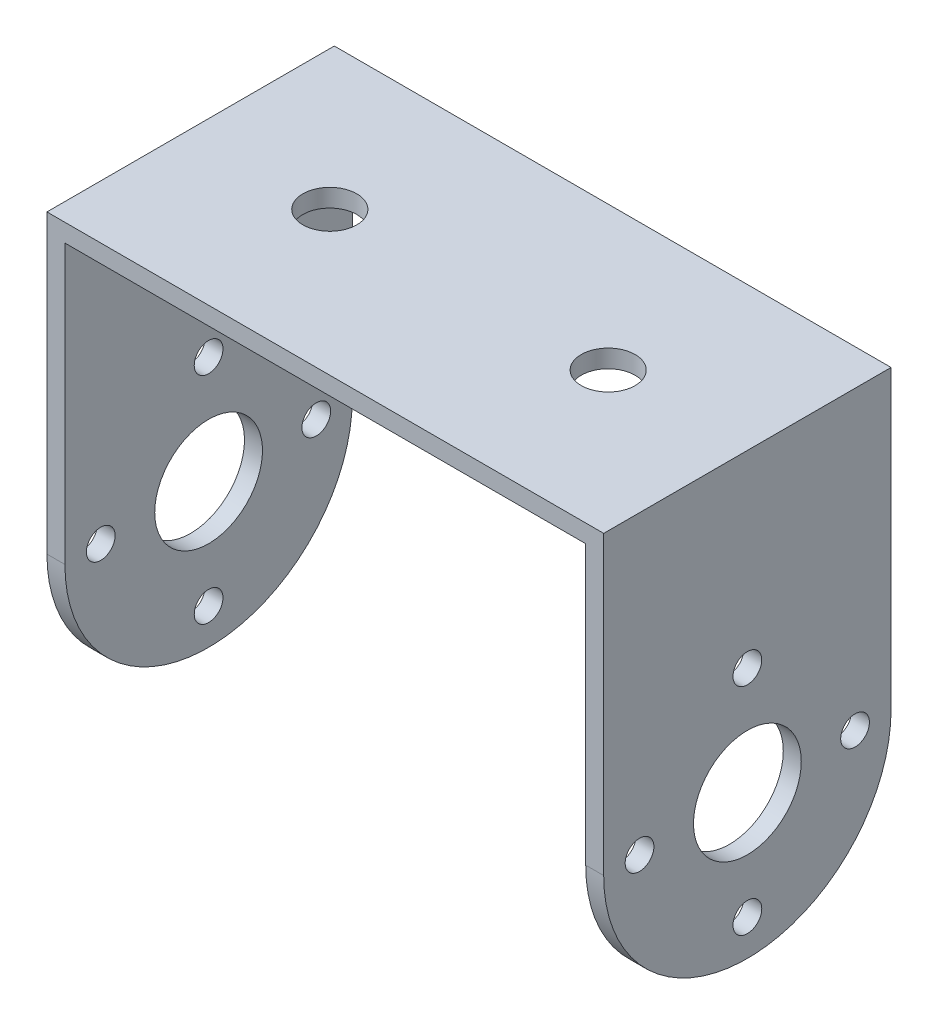
ISO-10303-21;
HEADER;
FILE_DESCRIPTION(('STEP AP214'),'2;1');
FILE_NAME('part.step','',(''),(''),'','','');
FILE_SCHEMA(('AUTOMOTIVE_DESIGN { 1 0 10303 214 1 1 1 1 }'));
ENDSEC;
DATA;
#1=APPLICATION_CONTEXT('core data for automotive mechanical design processes');
#2=APPLICATION_PROTOCOL_DEFINITION('international standard','automotive_design',2000,#1);
#3=PRODUCT_CONTEXT('',#1,'mechanical');
#4=PRODUCT('Part','Part','',(#3));
#5=PRODUCT_RELATED_PRODUCT_CATEGORY('part','',(#4));
#6=PRODUCT_DEFINITION_FORMATION('','',#4);
#7=PRODUCT_DEFINITION_CONTEXT('part definition',#1,'design');
#8=PRODUCT_DEFINITION('design','',#6,#7);
#9=PRODUCT_DEFINITION_SHAPE('','',#8);
#10=(LENGTH_UNIT() NAMED_UNIT(*) SI_UNIT(.MILLI.,.METRE.));
#11=(NAMED_UNIT(*) PLANE_ANGLE_UNIT() SI_UNIT($,.RADIAN.));
#12=(NAMED_UNIT(*) SI_UNIT($,.STERADIAN.) SOLID_ANGLE_UNIT());
#13=UNCERTAINTY_MEASURE_WITH_UNIT(LENGTH_MEASURE(1.E-05),#10,'distance_accuracy_value','');
#14=(GEOMETRIC_REPRESENTATION_CONTEXT(3) GLOBAL_UNCERTAINTY_ASSIGNED_CONTEXT((#13)) GLOBAL_UNIT_ASSIGNED_CONTEXT((#10,
#11,#12)) REPRESENTATION_CONTEXT('',''));
#15=CARTESIAN_POINT('',(0.,0.,0.));
#16=DIRECTION('',(0.,0.,1.));
#17=DIRECTION('',(1.,0.,0.));
#18=AXIS2_PLACEMENT_3D('',#15,#16,#17);
#19=CARTESIAN_POINT('',(31.,38.775594,-35.5206464472841));
#20=DIRECTION('',(-1.,0.,0.));
#21=DIRECTION('',(0.,0.,1.));
#22=AXIS2_PLACEMENT_3D('',#19,#20,#21);
#23=CYLINDRICAL_SURFACE('',#22,8.);
#24=DIRECTION('',(-1.,0.,0.));
#25=VECTOR('',#24,1.);
#26=CARTESIAN_POINT('',(31.,38.775594,-27.5206464472841));
#27=LINE('',#26,#25);
#28=CARTESIAN_POINT('',(31.,38.775594,-27.5206464472841));
#29=VERTEX_POINT('',#28);
#30=CARTESIAN_POINT('',(29.9988322937708,38.775594,-27.5206464472841));
#31=VERTEX_POINT('',#30);
#32=EDGE_CURVE('E146',#29,#31,#27,.T.);
#33=ORIENTED_EDGE('',*,*,#32,.T.);
#34=CARTESIAN_POINT('',(29.9988322937708,38.775594,-35.5206464472841));
#35=DIRECTION('',(1.,0.,0.));
#36=DIRECTION('',(0.,0.,-1.));
#37=AXIS2_PLACEMENT_3D('',#34,#35,#36);
#38=CIRCLE('',#37,8.);
#39=CARTESIAN_POINT('',(29.9988322937708,38.775594,-43.5206464472842));
#40=VERTEX_POINT('',#39);
#41=EDGE_CURVE('E184',#31,#40,#38,.T.);
#42=ORIENTED_EDGE('',*,*,#41,.T.);
#43=DIRECTION('',(-1.,0.,0.));
#44=VECTOR('',#43,1.);
#45=CARTESIAN_POINT('',(31.,38.775594,-43.5206464472842));
#46=LINE('',#45,#44);
#47=CARTESIAN_POINT('',(31.,38.775594,-43.5206464472842));
#48=VERTEX_POINT('',#47);
#49=EDGE_CURVE('E48',#48,#40,#46,.T.);
#50=ORIENTED_EDGE('',*,*,#49,.F.);
#51=CARTESIAN_POINT('',(31.,38.775594,-35.5206464472841));
#52=DIRECTION('',(1.,0.,0.));
#53=DIRECTION('',(0.,0.,-1.));
#54=AXIS2_PLACEMENT_3D('',#51,#52,#53);
#55=CIRCLE('',#54,8.);
#56=EDGE_CURVE('E118',#29,#48,#55,.T.);
#57=ORIENTED_EDGE('',*,*,#56,.F.);
#58=EDGE_LOOP('',(#33,#42,#50,#57));
#59=FACE_BOUND('',#58,.T.);
#60=ADVANCED_FACE('F40',(#59),#23,.T.);
#61=CARTESIAN_POINT('',(31.,44.775594,-35.5206464472841));
#62=DIRECTION('',(-1.,0.,0.));
#63=DIRECTION('',(0.,0.,1.));
#64=AXIS2_PLACEMENT_3D('',#61,#62,#63);
#65=CYLINDRICAL_SURFACE('',#64,0.799999999999996);
#66=CARTESIAN_POINT('',(1.00116770622924,44.775594,-35.5206464472841));
#67=DIRECTION('',(-1.,0.,0.));
#68=DIRECTION('',(0.,0.,1.));
#69=AXIS2_PLACEMENT_3D('',#66,#67,#68);
#70=CIRCLE('',#69,0.799999999999996);
#71=CARTESIAN_POINT('',(1.00116770622924,44.775594,-34.7206464472841));
#72=VERTEX_POINT('',#71);
#73=EDGE_CURVE('E212',#72,#72,#70,.T.);
#74=ORIENTED_EDGE('',*,*,#73,.F.);
#75=EDGE_LOOP('',(#74));
#76=FACE_BOUND('',#75,.T.);
#77=CARTESIAN_POINT('',(0.,44.775594,-35.5206464472841));
#78=DIRECTION('',(1.,0.,0.));
#79=DIRECTION('',(0.,0.,-1.));
#80=AXIS2_PLACEMENT_3D('',#77,#78,#79);
#81=CIRCLE('',#80,0.799999999999996);
#82=CARTESIAN_POINT('',(0.,44.775594,-36.3206464472841));
#83=VERTEX_POINT('',#82);
#84=EDGE_CURVE('E241',#83,#83,#81,.T.);
#85=ORIENTED_EDGE('',*,*,#84,.F.);
#86=EDGE_LOOP('',(#85));
#87=FACE_BOUND('',#86,.T.);
#88=ADVANCED_FACE('F174',(#76,#87),#65,.F.);
#89=CARTESIAN_POINT('',(31.,38.775594,-35.5206464472841));
#90=DIRECTION('',(-1.,0.,0.));
#91=DIRECTION('',(0.,0.,1.));
#92=AXIS2_PLACEMENT_3D('',#89,#90,#91);
#93=CYLINDRICAL_SURFACE('',#92,3.);
#94=CARTESIAN_POINT('',(1.00116770622924,38.775594,-35.5206464472841));
#95=DIRECTION('',(-1.,0.,0.));
#96=DIRECTION('',(0.,0.,1.));
#97=AXIS2_PLACEMENT_3D('',#94,#95,#96);
#98=CIRCLE('',#97,3.);
#99=CARTESIAN_POINT('',(1.00116770622924,38.775594,-32.5206464472841));
#100=VERTEX_POINT('',#99);
#101=EDGE_CURVE('E209',#100,#100,#98,.T.);
#102=ORIENTED_EDGE('',*,*,#101,.F.);
#103=EDGE_LOOP('',(#102));
#104=FACE_BOUND('',#103,.T.);
#105=CARTESIAN_POINT('',(0.,38.775594,-35.5206464472841));
#106=DIRECTION('',(1.,0.,0.));
#107=DIRECTION('',(0.,0.,-1.));
#108=AXIS2_PLACEMENT_3D('',#105,#106,#107);
#109=CIRCLE('',#108,3.);
#110=CARTESIAN_POINT('',(0.,38.775594,-38.5206464472841));
#111=VERTEX_POINT('',#110);
#112=EDGE_CURVE('E235',#111,#111,#109,.T.);
#113=ORIENTED_EDGE('',*,*,#112,.F.);
#114=EDGE_LOOP('',(#113));
#115=FACE_BOUND('',#114,.T.);
#116=ADVANCED_FACE('F179',(#104,#115),#93,.F.);
#117=CARTESIAN_POINT('',(31.,38.775594,-41.5158813921745));
#118=DIRECTION('',(-1.,0.,0.));
#119=DIRECTION('',(0.,0.,1.));
#120=AXIS2_PLACEMENT_3D('',#117,#118,#119);
#121=CYLINDRICAL_SURFACE('',#120,0.800000000000003);
#122=CARTESIAN_POINT('',(1.00116770622924,38.775594,-41.5158813921745));
#123=DIRECTION('',(-1.,0.,0.));
#124=DIRECTION('',(0.,0.,1.));
#125=AXIS2_PLACEMENT_3D('',#122,#123,#124);
#126=CIRCLE('',#125,0.800000000000003);
#127=CARTESIAN_POINT('',(1.00116770622924,38.775594,-40.7158813921745));
#128=VERTEX_POINT('',#127);
#129=EDGE_CURVE('E206',#128,#128,#126,.T.);
#130=ORIENTED_EDGE('',*,*,#129,.F.);
#131=EDGE_LOOP('',(#130));
#132=FACE_BOUND('',#131,.T.);
#133=CARTESIAN_POINT('',(0.,38.775594,-41.5158813921745));
#134=DIRECTION('',(1.,0.,0.));
#135=DIRECTION('',(0.,0.,-1.));
#136=AXIS2_PLACEMENT_3D('',#133,#134,#135);
#137=CIRCLE('',#136,0.800000000000003);
#138=CARTESIAN_POINT('',(0.,38.775594,-42.3158813921745));
#139=VERTEX_POINT('',#138);
#140=EDGE_CURVE('E229',#139,#139,#137,.T.);
#141=ORIENTED_EDGE('',*,*,#140,.F.);
#142=EDGE_LOOP('',(#141));
#143=FACE_BOUND('',#142,.T.);
#144=ADVANCED_FACE('F267',(#132,#143),#121,.F.);
#145=CARTESIAN_POINT('',(31.,32.775594,-35.5206464472841));
#146=DIRECTION('',(-1.,0.,0.));
#147=DIRECTION('',(0.,0.,1.));
#148=AXIS2_PLACEMENT_3D('',#145,#146,#147);
#149=CYLINDRICAL_SURFACE('',#148,0.799999999999996);
#150=CARTESIAN_POINT('',(1.00116770622924,32.775594,-35.5206464472841));
#151=DIRECTION('',(-1.,0.,0.));
#152=DIRECTION('',(0.,0.,1.));
#153=AXIS2_PLACEMENT_3D('',#150,#151,#152);
#154=CIRCLE('',#153,0.799999999999996);
#155=CARTESIAN_POINT('',(1.00116770622924,32.775594,-34.7206464472841));
#156=VERTEX_POINT('',#155);
#157=EDGE_CURVE('E203',#156,#156,#154,.T.);
#158=ORIENTED_EDGE('',*,*,#157,.F.);
#159=EDGE_LOOP('',(#158));
#160=FACE_BOUND('',#159,.T.);
#161=CARTESIAN_POINT('',(0.,32.775594,-35.5206464472841));
#162=DIRECTION('',(1.,0.,0.));
#163=DIRECTION('',(0.,0.,-1.));
#164=AXIS2_PLACEMENT_3D('',#161,#162,#163);
#165=CIRCLE('',#164,0.799999999999996);
#166=CARTESIAN_POINT('',(0.,32.775594,-36.3206464472841));
#167=VERTEX_POINT('',#166);
#168=EDGE_CURVE('E223',#167,#167,#165,.T.);
#169=ORIENTED_EDGE('',*,*,#168,.F.);
#170=EDGE_LOOP('',(#169));
#171=FACE_BOUND('',#170,.T.);
#172=ADVANCED_FACE('F259',(#160,#171),#149,.F.);
#173=CARTESIAN_POINT('',(31.,38.775594,-29.5158813921745));
#174=DIRECTION('',(-1.,0.,0.));
#175=DIRECTION('',(0.,0.,1.));
#176=AXIS2_PLACEMENT_3D('',#173,#174,#175);
#177=CYLINDRICAL_SURFACE('',#176,0.799999999999996);
#178=CARTESIAN_POINT('',(1.00116770622924,38.775594,-29.5158813921745));
#179=DIRECTION('',(-1.,0.,0.));
#180=DIRECTION('',(0.,0.,1.));
#181=AXIS2_PLACEMENT_3D('',#178,#179,#180);
#182=CIRCLE('',#181,0.799999999999996);
#183=CARTESIAN_POINT('',(1.00116770622924,38.775594,-28.7158813921745));
#184=VERTEX_POINT('',#183);
#185=EDGE_CURVE('E200',#184,#184,#182,.T.);
#186=ORIENTED_EDGE('',*,*,#185,.F.);
#187=EDGE_LOOP('',(#186));
#188=FACE_BOUND('',#187,.T.);
#189=CARTESIAN_POINT('',(0.,38.775594,-29.5158813921745));
#190=DIRECTION('',(1.,0.,0.));
#191=DIRECTION('',(0.,0.,-1.));
#192=AXIS2_PLACEMENT_3D('',#189,#190,#191);
#193=CIRCLE('',#192,0.799999999999996);
#194=CARTESIAN_POINT('',(0.,38.775594,-30.3158813921745));
#195=VERTEX_POINT('',#194);
#196=EDGE_CURVE('E219',#195,#195,#193,.T.);
#197=ORIENTED_EDGE('',*,*,#196,.F.);
#198=EDGE_LOOP('',(#197));
#199=FACE_BOUND('',#198,.T.);
#200=ADVANCED_FACE('F258',(#188,#199),#177,.F.);
#201=CARTESIAN_POINT('',(31.,55.275594,-43.5206464472842));
#202=DIRECTION('',(0.,0.,1.));
#203=DIRECTION('',(1.,0.,0.));
#204=AXIS2_PLACEMENT_3D('',#201,#202,#203);
#205=PLANE('',#204);
#206=ORIENTED_EDGE('',*,*,#49,.T.);
#207=DIRECTION('',(0.,1.,0.));
#208=VECTOR('',#207,1.);
#209=CARTESIAN_POINT('',(29.9988322937708,55.275594,-43.5206464472842));
#210=LINE('',#209,#208);
#211=CARTESIAN_POINT('',(29.9988322937708,54.275594,-43.5206464472842));
#212=VERTEX_POINT('',#211);
#213=EDGE_CURVE('E192',#40,#212,#210,.T.);
#214=ORIENTED_EDGE('',*,*,#213,.T.);
#215=DIRECTION('',(-1.,0.,0.));
#216=VECTOR('',#215,1.);
#217=CARTESIAN_POINT('',(0.,54.275594,-43.5206464472842));
#218=LINE('',#217,#216);
#219=CARTESIAN_POINT('',(1.00116770622924,54.275594,-43.5206464472842));
#220=VERTEX_POINT('',#219);
#221=EDGE_CURVE('E129',#212,#220,#218,.T.);
#222=ORIENTED_EDGE('',*,*,#221,.T.);
#223=DIRECTION('',(0.,-1.,0.));
#224=VECTOR('',#223,1.);
#225=CARTESIAN_POINT('',(1.00116770622924,55.275594,-43.5206464472842));
#226=LINE('',#225,#224);
#227=CARTESIAN_POINT('',(1.00116770622924,38.775594,-43.5206464472842));
#228=VERTEX_POINT('',#227);
#229=EDGE_CURVE('E154',#220,#228,#226,.T.);
#230=ORIENTED_EDGE('',*,*,#229,.T.);
#231=CARTESIAN_POINT('',(0.,38.775594,-43.5206464472842));
#232=VERTEX_POINT('',#231);
#233=EDGE_CURVE('E149',#228,#232,#46,.T.);
#234=ORIENTED_EDGE('',*,*,#233,.T.);
#235=DIRECTION('',(0.,1.,0.));
#236=VECTOR('',#235,1.);
#237=CARTESIAN_POINT('',(0.,55.275594,-43.5206464472842));
#238=LINE('',#237,#236);
#239=CARTESIAN_POINT('',(0.,55.275594,-43.5206464472842));
#240=VERTEX_POINT('',#239);
#241=EDGE_CURVE('E125',#232,#240,#238,.T.);
#242=ORIENTED_EDGE('',*,*,#241,.T.);
#243=DIRECTION('',(-1.,0.,0.));
#244=VECTOR('',#243,1.);
#245=CARTESIAN_POINT('',(0.,55.275594,-43.5206464472842));
#246=LINE('',#245,#244);
#247=CARTESIAN_POINT('',(31.,55.275594,-43.5206464472842));
#248=VERTEX_POINT('',#247);
#249=EDGE_CURVE('E122',#248,#240,#246,.T.);
#250=ORIENTED_EDGE('',*,*,#249,.F.);
#251=DIRECTION('',(0.,1.,0.));
#252=VECTOR('',#251,1.);
#253=CARTESIAN_POINT('',(31.,55.275594,-43.5206464472842));
#254=LINE('',#253,#252);
#255=EDGE_CURVE('E89',#48,#248,#254,.T.);
#256=ORIENTED_EDGE('',*,*,#255,.F.);
#257=EDGE_LOOP('',(#206,#214,#222,#230,#234,#242,#250,#256));
#258=FACE_BOUND('',#257,.T.);
#259=ADVANCED_FACE('F123',(#258),#205,.F.);
#260=CARTESIAN_POINT('',(31.,38.775594,-35.5206464472841));
#261=DIRECTION('',(1.,0.,0.));
#262=DIRECTION('',(0.,0.,-1.));
#263=AXIS2_PLACEMENT_3D('',#260,#261,#262);
#264=PLANE('',#263);
#265=ORIENTED_EDGE('',*,*,#255,.T.);
#266=DIRECTION('',(0.,0.,1.));
#267=VECTOR('',#266,1.);
#268=CARTESIAN_POINT('',(31.,55.275594,-27.5206464472841));
#269=LINE('',#268,#267);
#270=CARTESIAN_POINT('',(31.,55.275594,-27.5206464472841));
#271=VERTEX_POINT('',#270);
#272=EDGE_CURVE('E115',#248,#271,#269,.T.);
#273=ORIENTED_EDGE('',*,*,#272,.T.);
#274=DIRECTION('',(0.,-1.,0.));
#275=VECTOR('',#274,1.);
#276=CARTESIAN_POINT('',(31.,38.775594,-27.5206464472841));
#277=LINE('',#276,#275);
#278=EDGE_CURVE('E64',#271,#29,#277,.T.);
#279=ORIENTED_EDGE('',*,*,#278,.T.);
#280=ORIENTED_EDGE('',*,*,#56,.T.);
#281=EDGE_LOOP('',(#265,#273,#279,#280));
#282=FACE_BOUND('',#281,.T.);
#283=CARTESIAN_POINT('',(31.,32.775594,-35.5206464472841));
#284=DIRECTION('',(1.,0.,0.));
#285=DIRECTION('',(0.,0.,-1.));
#286=AXIS2_PLACEMENT_3D('',#283,#284,#285);
#287=CIRCLE('',#286,0.799999999999996);
#288=CARTESIAN_POINT('',(31.,32.775594,-36.3206464472841));
#289=VERTEX_POINT('',#288);
#290=EDGE_CURVE('E226',#289,#289,#287,.T.);
#291=ORIENTED_EDGE('',*,*,#290,.F.);
#292=EDGE_LOOP('',(#291));
#293=FACE_BOUND('',#292,.T.);
#294=CARTESIAN_POINT('',(31.,38.775594,-35.5206464472841));
#295=DIRECTION('',(1.,0.,0.));
#296=DIRECTION('',(0.,0.,-1.));
#297=AXIS2_PLACEMENT_3D('',#294,#295,#296);
#298=CIRCLE('',#297,3.);
#299=CARTESIAN_POINT('',(31.,38.775594,-38.5206464472841));
#300=VERTEX_POINT('',#299);
#301=EDGE_CURVE('E238',#300,#300,#298,.T.);
#302=ORIENTED_EDGE('',*,*,#301,.F.);
#303=EDGE_LOOP('',(#302));
#304=FACE_BOUND('',#303,.T.);
#305=CARTESIAN_POINT('',(31.,44.775594,-35.5206464472841));
#306=DIRECTION('',(1.,0.,0.));
#307=DIRECTION('',(0.,0.,-1.));
#308=AXIS2_PLACEMENT_3D('',#305,#306,#307);
#309=CIRCLE('',#308,0.799999999999996);
#310=CARTESIAN_POINT('',(31.,44.775594,-36.3206464472841));
#311=VERTEX_POINT('',#310);
#312=EDGE_CURVE('E140',#311,#311,#309,.T.);
#313=ORIENTED_EDGE('',*,*,#312,.F.);
#314=EDGE_LOOP('',(#313));
#315=FACE_BOUND('',#314,.T.);
#316=CARTESIAN_POINT('',(31.,38.775594,-41.5158813921745));
#317=DIRECTION('',(1.,0.,0.));
#318=DIRECTION('',(0.,0.,-1.));
#319=AXIS2_PLACEMENT_3D('',#316,#317,#318);
#320=CIRCLE('',#319,0.800000000000003);
#321=CARTESIAN_POINT('',(31.,38.775594,-42.3158813921745));
#322=VERTEX_POINT('',#321);
#323=EDGE_CURVE('E232',#322,#322,#320,.T.);
#324=ORIENTED_EDGE('',*,*,#323,.F.);
#325=EDGE_LOOP('',(#324));
#326=FACE_BOUND('',#325,.T.);
#327=CARTESIAN_POINT('',(31.,38.775594,-29.5158813921745));
#328=DIRECTION('',(1.,0.,0.));
#329=DIRECTION('',(0.,0.,-1.));
#330=AXIS2_PLACEMENT_3D('',#327,#328,#329);
#331=CIRCLE('',#330,0.799999999999996);
#332=CARTESIAN_POINT('',(31.,38.775594,-30.3158813921745));
#333=VERTEX_POINT('',#332);
#334=EDGE_CURVE('E220',#333,#333,#331,.T.);
#335=ORIENTED_EDGE('',*,*,#334,.F.);
#336=EDGE_LOOP('',(#335));
#337=FACE_BOUND('',#336,.T.);
#338=ADVANCED_FACE('F112',(#282,#293,#304,#315,#326,#337),#264,.T.);
#339=CARTESIAN_POINT('',(0.,38.775594,-35.5206464472841));
#340=DIRECTION('',(1.,0.,0.));
#341=DIRECTION('',(0.,0.,-1.));
#342=AXIS2_PLACEMENT_3D('',#339,#340,#341);
#343=PLANE('',#342);
#344=DIRECTION('',(0.,0.,1.));
#345=VECTOR('',#344,1.);
#346=CARTESIAN_POINT('',(0.,55.275594,-27.5206464472841));
#347=LINE('',#346,#345);
#348=CARTESIAN_POINT('',(0.,55.275594,-27.5206464472841));
#349=VERTEX_POINT('',#348);
#350=EDGE_CURVE('E142',#240,#349,#347,.T.);
#351=ORIENTED_EDGE('',*,*,#350,.F.);
#352=ORIENTED_EDGE('',*,*,#241,.F.);
#353=CARTESIAN_POINT('',(0.,38.775594,-35.5206464472841));
#354=DIRECTION('',(1.,0.,0.));
#355=DIRECTION('',(0.,0.,-1.));
#356=AXIS2_PLACEMENT_3D('',#353,#354,#355);
#357=CIRCLE('',#356,8.);
#358=CARTESIAN_POINT('',(0.,38.775594,-27.5206464472841));
#359=VERTEX_POINT('',#358);
#360=EDGE_CURVE('E138',#359,#232,#357,.T.);
#361=ORIENTED_EDGE('',*,*,#360,.F.);
#362=DIRECTION('',(0.,-1.,0.));
#363=VECTOR('',#362,1.);
#364=CARTESIAN_POINT('',(0.,38.775594,-27.5206464472841));
#365=LINE('',#364,#363);
#366=EDGE_CURVE('E144',#349,#359,#365,.T.);
#367=ORIENTED_EDGE('',*,*,#366,.F.);
#368=EDGE_LOOP('',(#351,#352,#361,#367));
#369=FACE_BOUND('',#368,.T.);
#370=ORIENTED_EDGE('',*,*,#84,.T.);
#371=EDGE_LOOP('',(#370));
#372=FACE_BOUND('',#371,.T.);
#373=ORIENTED_EDGE('',*,*,#112,.T.);
#374=EDGE_LOOP('',(#373));
#375=FACE_BOUND('',#374,.T.);
#376=ORIENTED_EDGE('',*,*,#140,.T.);
#377=EDGE_LOOP('',(#376));
#378=FACE_BOUND('',#377,.T.);
#379=ORIENTED_EDGE('',*,*,#168,.T.);
#380=EDGE_LOOP('',(#379));
#381=FACE_BOUND('',#380,.T.);
#382=ORIENTED_EDGE('',*,*,#196,.T.);
#383=EDGE_LOOP('',(#382));
#384=FACE_BOUND('',#383,.T.);
#385=ADVANCED_FACE('F157',(#369,#372,#375,#378,#381,#384),#343,.F.);
#386=CARTESIAN_POINT('',(1.00116770622924,38.775594,-35.5206464472841));
#387=DIRECTION('',(-1.,0.,0.));
#388=DIRECTION('',(0.,0.,1.));
#389=AXIS2_PLACEMENT_3D('',#386,#387,#388);
#390=CIRCLE('',#389,8.);
#391=CARTESIAN_POINT('',(1.00116770622924,38.775594,-27.5206464472841));
#392=VERTEX_POINT('',#391);
#393=EDGE_CURVE('E160',#228,#392,#390,.T.);
#394=ORIENTED_EDGE('',*,*,#393,.T.);
#395=EDGE_CURVE('E82',#392,#359,#27,.T.);
#396=ORIENTED_EDGE('',*,*,#395,.T.);
#397=ORIENTED_EDGE('',*,*,#360,.T.);
#398=ORIENTED_EDGE('',*,*,#233,.F.);
#399=EDGE_LOOP('',(#394,#396,#397,#398));
#400=FACE_BOUND('',#399,.T.);
#401=ADVANCED_FACE('F42',(#400),#23,.T.);
#402=CARTESIAN_POINT('',(31.,55.275594,-27.5206464472841));
#403=DIRECTION('',(0.,-1.,0.));
#404=DIRECTION('',(0.,0.,-1.));
#405=AXIS2_PLACEMENT_3D('',#402,#403,#404);
#406=PLANE('',#405);
#407=CARTESIAN_POINT('',(7.75,55.275594,-35.5206464472841));
#408=DIRECTION('',(0.,-1.,0.));
#409=DIRECTION('',(0.,0.,-1.));
#410=AXIS2_PLACEMENT_3D('',#407,#408,#409);
#411=CIRCLE('',#410,1.5);
#412=CARTESIAN_POINT('',(7.75,55.275594,-37.0206464472841));
#413=VERTEX_POINT('',#412);
#414=EDGE_CURVE('E361',#413,#413,#411,.T.);
#415=ORIENTED_EDGE('',*,*,#414,.T.);
#416=EDGE_LOOP('',(#415));
#417=FACE_BOUND('',#416,.T.);
#418=CARTESIAN_POINT('',(23.25,55.275594,-35.5206464472841));
#419=DIRECTION('',(0.,-1.,0.));
#420=DIRECTION('',(0.,0.,-1.));
#421=AXIS2_PLACEMENT_3D('',#418,#419,#420);
#422=CIRCLE('',#421,1.5);
#423=CARTESIAN_POINT('',(23.25,55.275594,-37.0206464472841));
#424=VERTEX_POINT('',#423);
#425=EDGE_CURVE('E372',#424,#424,#422,.T.);
#426=ORIENTED_EDGE('',*,*,#425,.T.);
#427=EDGE_LOOP('',(#426));
#428=FACE_BOUND('',#427,.T.);
#429=ORIENTED_EDGE('',*,*,#272,.F.);
#430=ORIENTED_EDGE('',*,*,#249,.T.);
#431=ORIENTED_EDGE('',*,*,#350,.T.);
#432=DIRECTION('',(-1.,0.,0.));
#433=VECTOR('',#432,1.);
#434=CARTESIAN_POINT('',(31.,55.275594,-27.5206464472841));
#435=LINE('',#434,#433);
#436=EDGE_CURVE('E133',#271,#349,#435,.T.);
#437=ORIENTED_EDGE('',*,*,#436,.F.);
#438=EDGE_LOOP('',(#429,#430,#431,#437));
#439=FACE_BOUND('',#438,.T.);
#440=ADVANCED_FACE('F131',(#417,#428,#439),#406,.F.);
#441=CARTESIAN_POINT('',(31.,38.775594,-27.5206464472841));
#442=DIRECTION('',(0.,0.,-1.));
#443=DIRECTION('',(-1.,0.,0.));
#444=AXIS2_PLACEMENT_3D('',#441,#442,#443);
#445=PLANE('',#444);
#446=ORIENTED_EDGE('',*,*,#395,.F.);
#447=DIRECTION('',(0.,1.,0.));
#448=VECTOR('',#447,1.);
#449=CARTESIAN_POINT('',(1.00116770622924,38.775594,-27.5206464472841));
#450=LINE('',#449,#448);
#451=CARTESIAN_POINT('',(1.00116770622924,54.275594,-27.5206464472841));
#452=VERTEX_POINT('',#451);
#453=EDGE_CURVE('E215',#392,#452,#450,.T.);
#454=ORIENTED_EDGE('',*,*,#453,.T.);
#455=DIRECTION('',(1.,0.,0.));
#456=VECTOR('',#455,1.);
#457=CARTESIAN_POINT('',(31.,54.275594,-27.5206464472841));
#458=LINE('',#457,#456);
#459=CARTESIAN_POINT('',(29.9988322937708,54.275594,-27.5206464472841));
#460=VERTEX_POINT('',#459);
#461=EDGE_CURVE('E11',#452,#460,#458,.T.);
#462=ORIENTED_EDGE('',*,*,#461,.T.);
#463=DIRECTION('',(0.,-1.,0.));
#464=VECTOR('',#463,1.);
#465=CARTESIAN_POINT('',(29.9988322937708,38.775594,-27.5206464472841));
#466=LINE('',#465,#464);
#467=EDGE_CURVE('E187',#460,#31,#466,.T.);
#468=ORIENTED_EDGE('',*,*,#467,.T.);
#469=ORIENTED_EDGE('',*,*,#32,.F.);
#470=ORIENTED_EDGE('',*,*,#278,.F.);
#471=ORIENTED_EDGE('',*,*,#436,.T.);
#472=ORIENTED_EDGE('',*,*,#366,.T.);
#473=EDGE_LOOP('',(#446,#454,#462,#468,#469,#470,#471,#472));
#474=FACE_BOUND('',#473,.T.);
#475=ADVANCED_FACE('F168',(#474),#445,.F.);
#476=CARTESIAN_POINT('',(29.9988322937708,44.775594,-35.5206464472841));
#477=DIRECTION('',(1.,0.,0.));
#478=DIRECTION('',(0.,0.,-1.));
#479=AXIS2_PLACEMENT_3D('',#476,#477,#478);
#480=CIRCLE('',#479,0.799999999999996);
#481=CARTESIAN_POINT('',(29.9988322937708,44.775594,-36.3206464472841));
#482=VERTEX_POINT('',#481);
#483=EDGE_CURVE('E190',#482,#482,#480,.T.);
#484=ORIENTED_EDGE('',*,*,#483,.F.);
#485=EDGE_LOOP('',(#484));
#486=FACE_BOUND('',#485,.T.);
#487=ORIENTED_EDGE('',*,*,#312,.T.);
#488=EDGE_LOOP('',(#487));
#489=FACE_BOUND('',#488,.T.);
#490=ADVANCED_FACE('F182',(#486,#489),#65,.F.);
#491=CARTESIAN_POINT('',(29.9988322937708,38.775594,-35.5206464472841));
#492=DIRECTION('',(1.,0.,0.));
#493=DIRECTION('',(0.,0.,-1.));
#494=AXIS2_PLACEMENT_3D('',#491,#492,#493);
#495=CIRCLE('',#494,3.);
#496=CARTESIAN_POINT('',(29.9988322937708,38.775594,-38.5206464472841));
#497=VERTEX_POINT('',#496);
#498=EDGE_CURVE('E195',#497,#497,#495,.T.);
#499=ORIENTED_EDGE('',*,*,#498,.F.);
#500=EDGE_LOOP('',(#499));
#501=FACE_BOUND('',#500,.T.);
#502=ORIENTED_EDGE('',*,*,#301,.T.);
#503=EDGE_LOOP('',(#502));
#504=FACE_BOUND('',#503,.T.);
#505=ADVANCED_FACE('F299',(#501,#504),#93,.F.);
#506=CARTESIAN_POINT('',(29.9988322937708,38.775594,-41.5158813921745));
#507=DIRECTION('',(1.,0.,0.));
#508=DIRECTION('',(0.,0.,-1.));
#509=AXIS2_PLACEMENT_3D('',#506,#507,#508);
#510=CIRCLE('',#509,0.800000000000003);
#511=CARTESIAN_POINT('',(29.9988322937708,38.775594,-42.3158813921745));
#512=VERTEX_POINT('',#511);
#513=EDGE_CURVE('E345',#512,#512,#510,.T.);
#514=ORIENTED_EDGE('',*,*,#513,.F.);
#515=EDGE_LOOP('',(#514));
#516=FACE_BOUND('',#515,.T.);
#517=ORIENTED_EDGE('',*,*,#323,.T.);
#518=EDGE_LOOP('',(#517));
#519=FACE_BOUND('',#518,.T.);
#520=ADVANCED_FACE('F282',(#516,#519),#121,.F.);
#521=CARTESIAN_POINT('',(29.9988322937708,32.775594,-35.5206464472841));
#522=DIRECTION('',(1.,0.,0.));
#523=DIRECTION('',(0.,0.,-1.));
#524=AXIS2_PLACEMENT_3D('',#521,#522,#523);
#525=CIRCLE('',#524,0.799999999999996);
#526=CARTESIAN_POINT('',(29.9988322937708,32.775594,-36.3206464472841));
#527=VERTEX_POINT('',#526);
#528=EDGE_CURVE('E342',#527,#527,#525,.T.);
#529=ORIENTED_EDGE('',*,*,#528,.F.);
#530=EDGE_LOOP('',(#529));
#531=FACE_BOUND('',#530,.T.);
#532=ORIENTED_EDGE('',*,*,#290,.T.);
#533=EDGE_LOOP('',(#532));
#534=FACE_BOUND('',#533,.T.);
#535=ADVANCED_FACE('F270',(#531,#534),#149,.F.);
#536=CARTESIAN_POINT('',(29.9988322937708,38.775594,-29.5158813921745));
#537=DIRECTION('',(1.,0.,0.));
#538=DIRECTION('',(0.,0.,-1.));
#539=AXIS2_PLACEMENT_3D('',#536,#537,#538);
#540=CIRCLE('',#539,0.799999999999996);
#541=CARTESIAN_POINT('',(29.9988322937708,38.775594,-30.3158813921745));
#542=VERTEX_POINT('',#541);
#543=EDGE_CURVE('E287',#542,#542,#540,.T.);
#544=ORIENTED_EDGE('',*,*,#543,.F.);
#545=EDGE_LOOP('',(#544));
#546=FACE_BOUND('',#545,.T.);
#547=ORIENTED_EDGE('',*,*,#334,.T.);
#548=EDGE_LOOP('',(#547));
#549=FACE_BOUND('',#548,.T.);
#550=ADVANCED_FACE('F262',(#546,#549),#177,.F.);
#551=CARTESIAN_POINT('',(15.5,54.275594,-81.2360931180725));
#552=DIRECTION('',(0.,1.,0.));
#553=DIRECTION('',(0.,0.,1.));
#554=AXIS2_PLACEMENT_3D('',#551,#552,#553);
#555=PLANE('',#554);
#556=CARTESIAN_POINT('',(7.75,54.275594,-35.5206464472841));
#557=DIRECTION('',(0.,-1.,0.));
#558=DIRECTION('',(0.,0.,-1.));
#559=AXIS2_PLACEMENT_3D('',#556,#557,#558);
#560=CIRCLE('',#559,1.5);
#561=CARTESIAN_POINT('',(7.75,54.275594,-37.0206464472841));
#562=VERTEX_POINT('',#561);
#563=EDGE_CURVE('E363',#562,#562,#560,.T.);
#564=ORIENTED_EDGE('',*,*,#563,.F.);
#565=EDGE_LOOP('',(#564));
#566=FACE_BOUND('',#565,.T.);
#567=CARTESIAN_POINT('',(23.25,54.275594,-35.5206464472841));
#568=DIRECTION('',(0.,-1.,0.));
#569=DIRECTION('',(0.,0.,-1.));
#570=AXIS2_PLACEMENT_3D('',#567,#568,#569);
#571=CIRCLE('',#570,1.5);
#572=CARTESIAN_POINT('',(23.25,54.275594,-37.0206464472841));
#573=VERTEX_POINT('',#572);
#574=EDGE_CURVE('E367',#573,#573,#571,.T.);
#575=ORIENTED_EDGE('',*,*,#574,.F.);
#576=EDGE_LOOP('',(#575));
#577=FACE_BOUND('',#576,.T.);
#578=DIRECTION('',(0.,0.,1.));
#579=VECTOR('',#578,1.);
#580=CARTESIAN_POINT('',(1.00116770622924,54.275594,-44.9169622158685));
#581=LINE('',#580,#579);
#582=EDGE_CURVE('E128',#220,#452,#581,.T.);
#583=ORIENTED_EDGE('',*,*,#582,.F.);
#584=ORIENTED_EDGE('',*,*,#221,.F.);
#585=DIRECTION('',(0.,0.,-1.));
#586=VECTOR('',#585,1.);
#587=CARTESIAN_POINT('',(29.9988322937708,54.275594,-44.9169622158685));
#588=LINE('',#587,#586);
#589=EDGE_CURVE('E55',#460,#212,#588,.T.);
#590=ORIENTED_EDGE('',*,*,#589,.F.);
#591=ORIENTED_EDGE('',*,*,#461,.F.);
#592=EDGE_LOOP('',(#583,#584,#590,#591));
#593=FACE_BOUND('',#592,.T.);
#594=ADVANCED_FACE('F274',(#566,#577,#593),#555,.F.);
#595=CARTESIAN_POINT('',(1.00116770622924,30.775594,-44.9169622158685));
#596=DIRECTION('',(-1.,0.,0.));
#597=DIRECTION('',(0.,0.,1.));
#598=AXIS2_PLACEMENT_3D('',#595,#596,#597);
#599=PLANE('',#598);
#600=ORIENTED_EDGE('',*,*,#73,.T.);
#601=EDGE_LOOP('',(#600));
#602=FACE_BOUND('',#601,.T.);
#603=ORIENTED_EDGE('',*,*,#101,.T.);
#604=EDGE_LOOP('',(#603));
#605=FACE_BOUND('',#604,.T.);
#606=ORIENTED_EDGE('',*,*,#129,.T.);
#607=EDGE_LOOP('',(#606));
#608=FACE_BOUND('',#607,.T.);
#609=ORIENTED_EDGE('',*,*,#157,.T.);
#610=EDGE_LOOP('',(#609));
#611=FACE_BOUND('',#610,.T.);
#612=ORIENTED_EDGE('',*,*,#185,.T.);
#613=EDGE_LOOP('',(#612));
#614=FACE_BOUND('',#613,.T.);
#615=ORIENTED_EDGE('',*,*,#582,.T.);
#616=ORIENTED_EDGE('',*,*,#453,.F.);
#617=ORIENTED_EDGE('',*,*,#393,.F.);
#618=ORIENTED_EDGE('',*,*,#229,.F.);
#619=EDGE_LOOP('',(#615,#616,#617,#618));
#620=FACE_BOUND('',#619,.T.);
#621=ADVANCED_FACE('F280',(#602,#605,#608,#611,#614,#620),#599,.F.);
#622=CARTESIAN_POINT('',(29.9988322937708,30.775594,-44.9169622158685));
#623=DIRECTION('',(1.,0.,0.));
#624=DIRECTION('',(0.,0.,-1.));
#625=AXIS2_PLACEMENT_3D('',#622,#623,#624);
#626=PLANE('',#625);
#627=ORIENTED_EDGE('',*,*,#483,.T.);
#628=EDGE_LOOP('',(#627));
#629=FACE_BOUND('',#628,.T.);
#630=ORIENTED_EDGE('',*,*,#498,.T.);
#631=EDGE_LOOP('',(#630));
#632=FACE_BOUND('',#631,.T.);
#633=ORIENTED_EDGE('',*,*,#513,.T.);
#634=EDGE_LOOP('',(#633));
#635=FACE_BOUND('',#634,.T.);
#636=ORIENTED_EDGE('',*,*,#528,.T.);
#637=EDGE_LOOP('',(#636));
#638=FACE_BOUND('',#637,.T.);
#639=ORIENTED_EDGE('',*,*,#543,.T.);
#640=EDGE_LOOP('',(#639));
#641=FACE_BOUND('',#640,.T.);
#642=ORIENTED_EDGE('',*,*,#41,.F.);
#643=ORIENTED_EDGE('',*,*,#467,.F.);
#644=ORIENTED_EDGE('',*,*,#589,.T.);
#645=ORIENTED_EDGE('',*,*,#213,.F.);
#646=EDGE_LOOP('',(#642,#643,#644,#645));
#647=FACE_BOUND('',#646,.T.);
#648=ADVANCED_FACE('F329',(#629,#632,#635,#638,#641,#647),#626,.F.);
#649=CARTESIAN_POINT('',(23.25,55.275594,-35.5206464472841));
#650=DIRECTION('',(0.,-1.,0.));
#651=DIRECTION('',(0.,0.,-1.));
#652=AXIS2_PLACEMENT_3D('',#649,#650,#651);
#653=CYLINDRICAL_SURFACE('',#652,1.5);
#654=ORIENTED_EDGE('',*,*,#425,.F.);
#655=EDGE_LOOP('',(#654));
#656=FACE_BOUND('',#655,.T.);
#657=ORIENTED_EDGE('',*,*,#574,.T.);
#658=EDGE_LOOP('',(#657));
#659=FACE_BOUND('',#658,.T.);
#660=ADVANCED_FACE('F355',(#656,#659),#653,.F.);
#661=CARTESIAN_POINT('',(7.75,55.275594,-35.5206464472841));
#662=DIRECTION('',(0.,-1.,0.));
#663=DIRECTION('',(0.,0.,-1.));
#664=AXIS2_PLACEMENT_3D('',#661,#662,#663);
#665=CYLINDRICAL_SURFACE('',#664,1.5);
#666=ORIENTED_EDGE('',*,*,#414,.F.);
#667=EDGE_LOOP('',(#666));
#668=FACE_BOUND('',#667,.T.);
#669=ORIENTED_EDGE('',*,*,#563,.T.);
#670=EDGE_LOOP('',(#669));
#671=FACE_BOUND('',#670,.T.);
#672=ADVANCED_FACE('F379',(#668,#671),#665,.F.);
#673=CLOSED_SHELL('',(#60,#88,#116,#144,#172,#200,#259,#338,#385,#401,#440,#475,#490,#505,#520,
#535,#550,#594,#621,#648,#660,#672));
#674=MANIFOLD_SOLID_BREP('B2',#673);
#675=ADVANCED_BREP_SHAPE_REPRESENTATION('',(#18,#674),#14);
#676=SHAPE_DEFINITION_REPRESENTATION(#9,#675);
ENDSEC;
END-ISO-10303-21;
